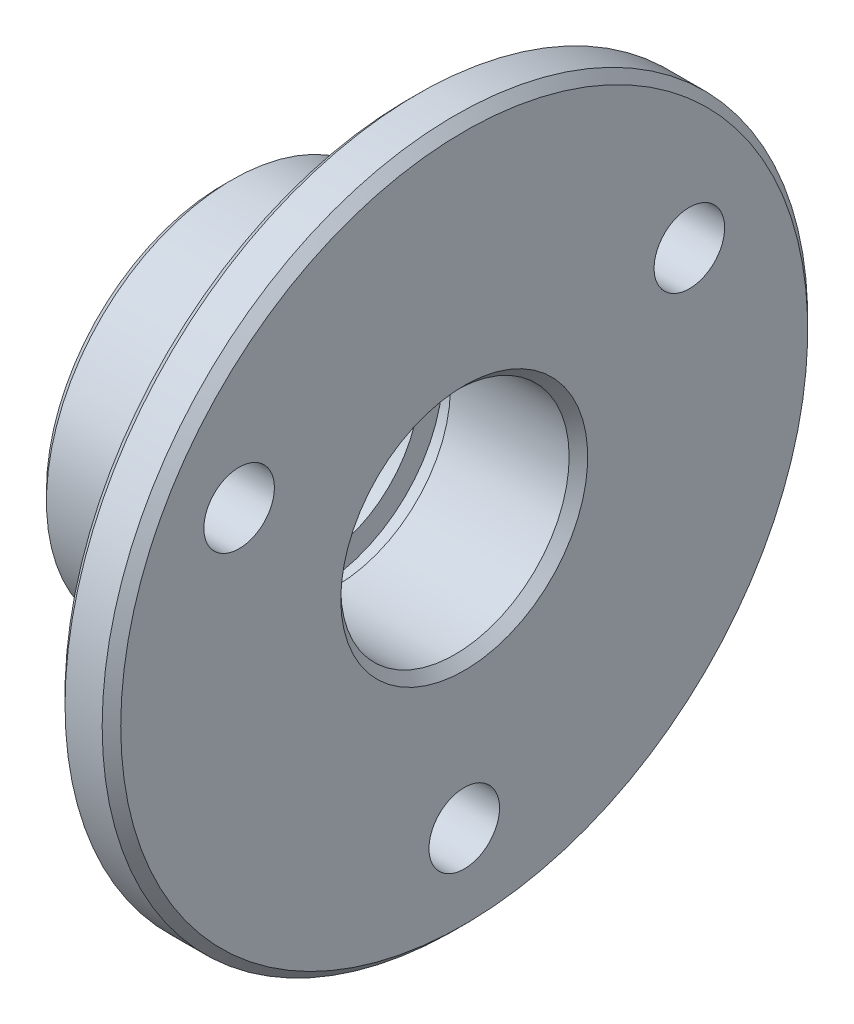
ISO-10303-21;
HEADER;
FILE_DESCRIPTION(('STEP AP214'),'2;1');
FILE_NAME('part.step','',(''),(''),'','','');
FILE_SCHEMA(('AUTOMOTIVE_DESIGN { 1 0 10303 214 1 1 1 1 }'));
ENDSEC;
DATA;
#1=APPLICATION_CONTEXT('core data for automotive mechanical design processes');
#2=APPLICATION_PROTOCOL_DEFINITION('international standard','automotive_design',2000,#1);
#3=PRODUCT_CONTEXT('',#1,'mechanical');
#4=PRODUCT('Part','Part','',(#3));
#5=PRODUCT_RELATED_PRODUCT_CATEGORY('part','',(#4));
#6=PRODUCT_DEFINITION_FORMATION('','',#4);
#7=PRODUCT_DEFINITION_CONTEXT('part definition',#1,'design');
#8=PRODUCT_DEFINITION('design','',#6,#7);
#9=PRODUCT_DEFINITION_SHAPE('','',#8);
#10=(LENGTH_UNIT() NAMED_UNIT(*) SI_UNIT(.MILLI.,.METRE.));
#11=(NAMED_UNIT(*) PLANE_ANGLE_UNIT() SI_UNIT($,.RADIAN.));
#12=(NAMED_UNIT(*) SI_UNIT($,.STERADIAN.) SOLID_ANGLE_UNIT());
#13=UNCERTAINTY_MEASURE_WITH_UNIT(LENGTH_MEASURE(1.E-05),#10,'distance_accuracy_value','');
#14=(GEOMETRIC_REPRESENTATION_CONTEXT(3) GLOBAL_UNCERTAINTY_ASSIGNED_CONTEXT((#13)) GLOBAL_UNIT_ASSIGNED_CONTEXT((#10,
#11,#12)) REPRESENTATION_CONTEXT('',''));
#15=CARTESIAN_POINT('',(0.,0.,0.));
#16=DIRECTION('',(0.,0.,1.));
#17=DIRECTION('',(1.,0.,0.));
#18=AXIS2_PLACEMENT_3D('',#15,#16,#17);
#19=CARTESIAN_POINT('',(44.2842712474619,0.,0.));
#20=DIRECTION('',(-1.,0.,0.));
#21=DIRECTION('',(0.,0.,1.));
#22=AXIS2_PLACEMENT_3D('',#19,#20,#21);
#23=CYLINDRICAL_SURFACE('',#22,10.);
#24=CARTESIAN_POINT('',(0.5,0.,0.));
#25=DIRECTION('',(1.,0.,0.));
#26=DIRECTION('',(0.,0.,-1.));
#27=AXIS2_PLACEMENT_3D('',#24,#25,#26);
#28=CIRCLE('',#27,10.);
#29=CARTESIAN_POINT('',(0.5,0.,-10.));
#30=VERTEX_POINT('',#29);
#31=EDGE_CURVE('E67',#30,#30,#28,.T.);
#32=ORIENTED_EDGE('',*,*,#31,.T.);
#33=EDGE_LOOP('',(#32));
#34=FACE_BOUND('',#33,.T.);
#35=CARTESIAN_POINT('',(6.9465,9.92156741649221,1.25));
#36=CARTESIAN_POINT('',(6.87658185810409,9.92156842085664,1.24999702741697));
#37=CARTESIAN_POINT('',(6.80662001754759,9.92231447559472,1.24411394951064));
#38=CARTESIAN_POINT('',(6.6686433872977,9.92521695489985,1.22073820686067));
#39=CARTESIAN_POINT('',(6.60063070975148,9.92737485321481,1.20323341054565));
#40=CARTESIAN_POINT('',(6.46857005894199,9.93285286887714,1.15713834641298));
#41=CARTESIAN_POINT('',(6.40451942894067,9.93617219726825,1.12855560239912));
#42=CARTESIAN_POINT('',(6.28213577408846,9.94359811759954,1.06113209921476));
#43=CARTESIAN_POINT('',(6.22380177412847,9.94770457492142,1.02229309368739));
#44=CARTESIAN_POINT('',(6.11416887643894,9.9562677962195,0.935226725132208));
#45=CARTESIAN_POINT('',(6.06290659884056,9.96072620851022,0.886953407512147));
#46=CARTESIAN_POINT('',(5.96918861553046,9.96947616437916,0.782487630335613));
#47=CARTESIAN_POINT('',(5.92673334795266,9.97376769964692,0.726294777029015));
#48=CARTESIAN_POINT('',(5.85170321024682,9.98171722306411,0.607354915337984));
#49=CARTESIAN_POINT('',(5.81916147745017,9.98537306923403,0.544586847780555));
#50=CARTESIAN_POINT('',(5.76509440002952,9.99162118477263,0.414423359027957));
#51=CARTESIAN_POINT('',(5.74356864653674,9.99421349361484,0.347028109680451));
#52=CARTESIAN_POINT('',(5.71225396583279,9.99803084353114,0.209897843875555));
#53=CARTESIAN_POINT('',(5.70240416073806,9.9992629741797,0.140176929831687));
#54=CARTESIAN_POINT('',(5.69453230748173,10.0002453486461,6.16003432718786E-05));
#55=CARTESIAN_POINT('',(5.69650979402373,9.99999565076039,-0.0703327884973868));
#56=CARTESIAN_POINT('',(5.71218760137872,9.99804823885005,-0.209382634487275));
#57=CARTESIAN_POINT('',(5.72582244924069,9.99635861227864,-0.278045602882228));
#58=CARTESIAN_POINT('',(5.76432558831497,9.99173027971167,-0.412101081952689));
#59=CARTESIAN_POINT('',(5.78919409308342,9.98879154997023,-0.477493530428104));
#60=CARTESIAN_POINT('',(5.8495282463919,9.98198128903956,-0.60335440771932));
#61=CARTESIAN_POINT('',(5.88502222886509,9.97810726921619,-0.66380911392026));
#62=CARTESIAN_POINT('',(5.96557918110802,9.96985984532641,-0.777928726153239));
#63=CARTESIAN_POINT('',(6.01064258973429,9.96548641836132,-0.831593320608679));
#64=CARTESIAN_POINT('',(6.10942590929919,9.95669433761757,-0.930994015386473));
#65=CARTESIAN_POINT('',(6.16320287977334,9.95227557902364,-0.976673419997998));
#66=CARTESIAN_POINT('',(6.27769077839123,9.9439203597029,-1.05836642531255));
#67=CARTESIAN_POINT('',(6.33840172826903,9.9399839004879,-1.09437999571755));
#68=CARTESIAN_POINT('',(6.46508474778117,9.93303901306359,-1.15572228679137));
#69=CARTESIAN_POINT('',(6.5310590399766,9.93003097954065,-1.18104646493116));
#70=CARTESIAN_POINT('',(6.66636972676342,9.92529121247978,-1.22024082723404));
#71=CARTESIAN_POINT('',(6.73570595915436,9.92355941743351,-1.23411156339981));
#72=CARTESIAN_POINT('',(6.87527159099989,9.92157944392025,-1.2499302159543));
#73=CARTESIAN_POINT('',(6.9454918115444,9.92132133721188,-1.25195792099914));
#74=CARTESIAN_POINT('',(7.08527096483271,9.92229170559824,-1.24424347661528));
#75=CARTESIAN_POINT('',(7.15482991163966,9.92352014900725,-1.2345015780549));
#76=CARTESIAN_POINT('',(7.29107288178893,9.92731614241993,-1.20359164289886));
#77=CARTESIAN_POINT('',(7.3577658075952,9.92987916347331,-1.18246224187303));
#78=CARTESIAN_POINT('',(7.48666207742658,9.93605184985404,-1.12941685955806));
#79=CARTESIAN_POINT('',(7.54886526362044,9.93966155195382,-1.09750049929061));
#80=CARTESIAN_POINT('',(7.6673773219065,9.94754465676617,-1.02359101107746));
#81=CARTESIAN_POINT('',(7.72365333265721,9.95182146368541,-0.981545559788551));
#82=CARTESIAN_POINT('',(7.82837827696752,9.96054619775512,-0.888645371184476));
#83=CARTESIAN_POINT('',(7.87682690593399,9.96499413155644,-0.83779029121274));
#84=CARTESIAN_POINT('',(7.9648020936672,9.97359044343479,-0.72836588777926));
#85=CARTESIAN_POINT('',(8.0042762233975,9.97773696956261,-0.669754246058515));
#86=CARTESIAN_POINT('',(8.0728191088169,9.98523556515805,-0.546686290840893));
#87=CARTESIAN_POINT('',(8.10188807424049,9.98858765063858,-0.48223009518416));
#88=CARTESIAN_POINT('',(8.14870889345402,9.99411145326594,-0.349476929569726));
#89=CARTESIAN_POINT('',(8.16649104801581,9.99628632843852,-0.281190783255888));
#90=CARTESIAN_POINT('',(8.19033204461338,9.99922377338782,-0.142573028638979));
#91=CARTESIAN_POINT('',(8.19639141529962,9.99998640685089,-0.0722415127190522));
#92=CARTESIAN_POINT('',(8.19660496114608,10.0000131400683,0.0679585916718929));
#93=CARTESIAN_POINT('',(8.19083998028399,9.9992874158392,0.137827068857368));
#94=CARTESIAN_POINT('',(8.16773969328458,9.99643920578969,0.275593870726307));
#95=CARTESIAN_POINT('',(8.15040439519412,9.99431672094073,0.343492196779925));
#96=CARTESIAN_POINT('',(8.10468094282515,9.98891242606016,0.475380721493659));
#97=CARTESIAN_POINT('',(8.07629666031339,9.98563102217235,0.539372280079787));
#98=CARTESIAN_POINT('',(8.00928934269622,9.9782722380314,0.661696668572013));
#99=CARTESIAN_POINT('',(7.97066618586915,9.97419484831559,0.720029431194016));
#100=CARTESIAN_POINT('',(7.88397839233181,9.96566596962789,0.829793383981279));
#101=CARTESIAN_POINT('',(7.83585360323817,9.9612122063946,0.88117689391715));
#102=CARTESIAN_POINT('',(7.73165352798557,9.95245079506771,0.975170559409672));
#103=CARTESIAN_POINT('',(7.67557636125455,9.94814318183499,1.01777863389674));
#104=CARTESIAN_POINT('',(7.55681503865132,9.94014405697344,1.09315262125802));
#105=CARTESIAN_POINT('',(7.49410620503245,9.93645498876141,1.12587989158337));
#106=CARTESIAN_POINT('',(7.36407162970262,9.93013929059811,1.18029264417168));
#107=CARTESIAN_POINT('',(7.2967510003483,9.92751150576939,1.20199013561416));
#108=CARTESIAN_POINT('',(7.18198500647823,9.92425393409921,1.22853294811899));
#109=CARTESIAN_POINT('',(7.13526352423121,9.92325150760955,1.23657151550529));
#110=CARTESIAN_POINT('',(7.04120137501654,9.92190791114956,1.24730602795275));
#111=CARTESIAN_POINT('',(6.99386071274952,9.92156673616213,1.25000201354966));
#112=CARTESIAN_POINT('',(6.9465,9.92156741649221,1.25));
#113=B_SPLINE_CURVE_WITH_KNOTS('',3,(#35,#36,#37,#38,#39,#40,#41,#42,#43,#44,#45,#46,#47,#48,
#49,#50,#51,#52,#53,#54,#55,#56,#57,#58,#59,#60,#61,#62,#63,#64,#65,#66,#67,#68,#69,#70,#71,#72,
#73,#74,#75,#76,#77,#78,#79,#80,#81,#82,#83,#84,#85,#86,#87,#88,#89,#90,#91,#92,#93,#94,#95,#96,
#97,#98,#99,#100,#101,#102,#103,#104,#105,#106,#107,#108,#109,#110,#111,#112),.UNSPECIFIED.,.T.,
.F.,(4,2,2,2,2,2,2,2,2,2,2,2,2,2,2,2,2,2,2,2,2,2,2,2,2,2,2,2,2,2,2,2,2,2,2,2,2,2,4),(0.,
0.20958140873962,0.419381938076191,0.6290402262906,0.838662689753063,1.04933288774533,
1.26001356371289,1.4713909307287,1.68276045169915,1.89302298470729,2.10327724585054,
2.31235832466519,2.52144337835894,2.73109102206402,2.94074828234552,3.15183848688885,
3.36292935309712,3.57410983369504,3.78528013578094,3.99502608902941,4.20476757163557,
4.41380188146366,4.62284353605926,4.83298909772055,5.04314283497405,5.25449442946171,
5.46584176354439,5.6766192839247,5.88738729886405,6.09671908144127,6.30605071843394,
6.51530906772045,6.72456990482124,6.93520064445417,7.14588127719914,7.35737548852417,
7.56863892991008,7.71060494816474,7.85256988927736),.UNSPECIFIED.);
#114=CARTESIAN_POINT('',(6.9465,9.92156741649221,1.25));
#115=VERTEX_POINT('',#114);
#116=EDGE_CURVE('E137',#115,#115,#113,.T.);
#117=ORIENTED_EDGE('',*,*,#116,.T.);
#118=EDGE_LOOP('',(#117));
#119=FACE_BOUND('',#118,.T.);
#120=CARTESIAN_POINT('',(9.99999999999999,0.,0.));
#121=DIRECTION('',(1.,0.,0.));
#122=DIRECTION('',(0.,0.,-1.));
#123=AXIS2_PLACEMENT_3D('',#120,#121,#122);
#124=CIRCLE('',#123,10.);
#125=CARTESIAN_POINT('',(9.99999999999999,0.,-10.));
#126=VERTEX_POINT('',#125);
#127=EDGE_CURVE('E90',#126,#126,#124,.T.);
#128=ORIENTED_EDGE('',*,*,#127,.F.);
#129=EDGE_LOOP('',(#128));
#130=FACE_BOUND('',#129,.T.);
#131=ADVANCED_FACE('F35',(#34,#119,#130),#23,.T.);
#132=CARTESIAN_POINT('',(0.,0.,0.));
#133=DIRECTION('',(1.,0.,0.));
#134=DIRECTION('',(0.,0.,-1.));
#135=AXIS2_PLACEMENT_3D('',#132,#133,#134);
#136=PLANE('',#135);
#137=CARTESIAN_POINT('',(0.,0.,0.));
#138=DIRECTION('',(1.,0.,0.));
#139=DIRECTION('',(0.,0.,-1.));
#140=AXIS2_PLACEMENT_3D('',#137,#138,#139);
#141=CIRCLE('',#140,9.50000000000001);
#142=CARTESIAN_POINT('',(0.,0.,-9.50000000000001));
#143=VERTEX_POINT('',#142);
#144=EDGE_CURVE('E182',#143,#143,#141,.F.);
#145=ORIENTED_EDGE('',*,*,#144,.T.);
#146=EDGE_LOOP('',(#145));
#147=FACE_BOUND('',#146,.T.);
#148=CARTESIAN_POINT('',(0.,0.,0.));
#149=DIRECTION('',(1.,0.,0.));
#150=DIRECTION('',(0.,0.,-1.));
#151=AXIS2_PLACEMENT_3D('',#148,#149,#150);
#152=CIRCLE('',#151,5.99999999999999);
#153=CARTESIAN_POINT('',(0.,0.,-5.99999999999999));
#154=VERTEX_POINT('',#153);
#155=EDGE_CURVE('E202',#154,#154,#152,.T.);
#156=ORIENTED_EDGE('',*,*,#155,.T.);
#157=EDGE_LOOP('',(#156));
#158=FACE_BOUND('',#157,.T.);
#159=ADVANCED_FACE('F122',(#147,#158),#136,.F.);
#160=CARTESIAN_POINT('',(13.,20.2,30.));
#161=DIRECTION('',(-1.,0.,0.));
#162=DIRECTION('',(0.,0.,1.));
#163=AXIS2_PLACEMENT_3D('',#160,#161,#162);
#164=PLANE('',#163);
#165=CARTESIAN_POINT('',(13.,0.,0.));
#166=DIRECTION('',(-1.,0.,0.));
#167=DIRECTION('',(0.,0.,1.));
#168=AXIS2_PLACEMENT_3D('',#165,#166,#167);
#169=CIRCLE('',#168,18.5);
#170=CARTESIAN_POINT('',(13.,0.,18.5));
#171=VERTEX_POINT('',#170);
#172=EDGE_CURVE('E11',#171,#171,#169,.F.);
#173=ORIENTED_EDGE('',*,*,#172,.T.);
#174=EDGE_LOOP('',(#173));
#175=FACE_BOUND('',#174,.T.);
#176=CARTESIAN_POINT('',(13.,6.99999999999989,-12.1243556529822));
#177=DIRECTION('',(1.,0.,0.));
#178=DIRECTION('',(0.,0.,-1.));
#179=AXIS2_PLACEMENT_3D('',#176,#177,#178);
#180=CIRCLE('',#179,1.89999999999999);
#181=CARTESIAN_POINT('',(13.,6.99999999999989,-14.0243556529822));
#182=VERTEX_POINT('',#181);
#183=EDGE_CURVE('E236',#182,#182,#180,.T.);
#184=ORIENTED_EDGE('',*,*,#183,.F.);
#185=EDGE_LOOP('',(#184));
#186=FACE_BOUND('',#185,.T.);
#187=CARTESIAN_POINT('',(13.,7.00000000000006,12.1243556529821));
#188=DIRECTION('',(1.,0.,0.));
#189=DIRECTION('',(0.,0.,-1.));
#190=AXIS2_PLACEMENT_3D('',#187,#188,#189);
#191=CIRCLE('',#190,1.89999999999999);
#192=CARTESIAN_POINT('',(13.,7.00000000000006,10.2243556529821));
#193=VERTEX_POINT('',#192);
#194=EDGE_CURVE('E240',#193,#193,#191,.T.);
#195=ORIENTED_EDGE('',*,*,#194,.F.);
#196=EDGE_LOOP('',(#195));
#197=FACE_BOUND('',#196,.T.);
#198=CARTESIAN_POINT('',(13.,-14.,0.));
#199=DIRECTION('',(1.,0.,0.));
#200=DIRECTION('',(0.,0.,-1.));
#201=AXIS2_PLACEMENT_3D('',#198,#199,#200);
#202=CIRCLE('',#201,1.89999999999999);
#203=CARTESIAN_POINT('',(13.,-14.,-1.89999999999999));
#204=VERTEX_POINT('',#203);
#205=EDGE_CURVE('E244',#204,#204,#202,.T.);
#206=ORIENTED_EDGE('',*,*,#205,.F.);
#207=EDGE_LOOP('',(#206));
#208=FACE_BOUND('',#207,.T.);
#209=CARTESIAN_POINT('',(13.,0.,0.));
#210=DIRECTION('',(-1.,0.,0.));
#211=DIRECTION('',(0.,0.,1.));
#212=AXIS2_PLACEMENT_3D('',#209,#210,#211);
#213=CIRCLE('',#212,6.65000000000003);
#214=CARTESIAN_POINT('',(13.,0.,6.65000000000003));
#215=VERTEX_POINT('',#214);
#216=EDGE_CURVE('E68',#215,#215,#213,.T.);
#217=ORIENTED_EDGE('',*,*,#216,.T.);
#218=EDGE_LOOP('',(#217));
#219=FACE_BOUND('',#218,.T.);
#220=ADVANCED_FACE('F128',(#175,#186,#197,#208,#219),#164,.F.);
#221=CARTESIAN_POINT('',(0.,0.,0.));
#222=DIRECTION('',(-1.,0.,0.));
#223=DIRECTION('',(0.,0.,1.));
#224=AXIS2_PLACEMENT_3D('',#221,#222,#223);
#225=CYLINDRICAL_SURFACE('',#224,5.49999999999999);
#226=CARTESIAN_POINT('',(5.105,0.,0.));
#227=DIRECTION('',(-1.,0.,0.));
#228=DIRECTION('',(0.,0.,1.));
#229=AXIS2_PLACEMENT_3D('',#226,#227,#228);
#230=CIRCLE('',#229,5.49999999999999);
#231=CARTESIAN_POINT('',(5.105,0.,5.49999999999999));
#232=VERTEX_POINT('',#231);
#233=EDGE_CURVE('E78',#232,#232,#230,.F.);
#234=ORIENTED_EDGE('',*,*,#233,.T.);
#235=EDGE_LOOP('',(#234));
#236=FACE_BOUND('',#235,.T.);
#237=CARTESIAN_POINT('',(0.499999999999994,0.,0.));
#238=DIRECTION('',(1.,0.,0.));
#239=DIRECTION('',(0.,0.,-1.));
#240=AXIS2_PLACEMENT_3D('',#237,#238,#239);
#241=CIRCLE('',#240,5.49999999999999);
#242=CARTESIAN_POINT('',(0.499999999999994,0.,-5.49999999999999));
#243=VERTEX_POINT('',#242);
#244=EDGE_CURVE('E81',#243,#243,#241,.F.);
#245=ORIENTED_EDGE('',*,*,#244,.T.);
#246=EDGE_LOOP('',(#245));
#247=FACE_BOUND('',#246,.T.);
#248=ADVANCED_FACE('F221',(#236,#247),#225,.F.);
#249=CARTESIAN_POINT('',(0.499999999999994,0.,0.));
#250=DIRECTION('',(-1.,0.,0.));
#251=DIRECTION('',(0.,0.,1.));
#252=AXIS2_PLACEMENT_3D('',#249,#250,#251);
#253=CONICAL_SURFACE('',#252,5.49999999999999,0.78539816339745);
#254=ORIENTED_EDGE('',*,*,#155,.F.);
#255=EDGE_LOOP('',(#254));
#256=FACE_BOUND('',#255,.T.);
#257=ORIENTED_EDGE('',*,*,#244,.F.);
#258=EDGE_LOOP('',(#257));
#259=FACE_BOUND('',#258,.T.);
#260=ADVANCED_FACE('F135',(#256,#259),#253,.F.);
#261=CARTESIAN_POINT('',(5.105,0.,0.));
#262=DIRECTION('',(-1.,0.,0.));
#263=DIRECTION('',(0.,0.,1.));
#264=AXIS2_PLACEMENT_3D('',#261,#262,#263);
#265=PLANE('',#264);
#266=ORIENTED_EDGE('',*,*,#233,.F.);
#267=EDGE_LOOP('',(#266));
#268=FACE_BOUND('',#267,.T.);
#269=CARTESIAN_POINT('',(5.105,0.,0.));
#270=DIRECTION('',(1.,0.,0.));
#271=DIRECTION('',(0.,0.,-1.));
#272=AXIS2_PLACEMENT_3D('',#269,#270,#271);
#273=CIRCLE('',#272,6.75);
#274=CARTESIAN_POINT('',(5.105,0.,-6.75));
#275=VERTEX_POINT('',#274);
#276=EDGE_CURVE('E83',#275,#275,#273,.T.);
#277=ORIENTED_EDGE('',*,*,#276,.T.);
#278=EDGE_LOOP('',(#277));
#279=FACE_BOUND('',#278,.T.);
#280=ADVANCED_FACE('F212',(#268,#279),#265,.F.);
#281=CARTESIAN_POINT('',(-12.2898268171891,0.,0.));
#282=DIRECTION('',(1.,0.,0.));
#283=DIRECTION('',(0.,0.,-1.));
#284=AXIS2_PLACEMENT_3D('',#281,#282,#283);
#285=CYLINDRICAL_SURFACE('',#284,6.15);
#286=CARTESIAN_POINT('',(12.5,0.,0.));
#287=DIRECTION('',(-1.,0.,0.));
#288=DIRECTION('',(0.,0.,1.));
#289=AXIS2_PLACEMENT_3D('',#286,#287,#288);
#290=CIRCLE('',#289,6.15);
#291=CARTESIAN_POINT('',(12.5,0.,6.15));
#292=VERTEX_POINT('',#291);
#293=EDGE_CURVE('E87',#292,#292,#290,.F.);
#294=ORIENTED_EDGE('',*,*,#293,.T.);
#295=EDGE_LOOP('',(#294));
#296=FACE_BOUND('',#295,.T.);
#297=CARTESIAN_POINT('',(6.105,0.,0.));
#298=DIRECTION('',(1.,0.,0.));
#299=DIRECTION('',(0.,0.,-1.));
#300=AXIS2_PLACEMENT_3D('',#297,#298,#299);
#301=CIRCLE('',#300,6.15);
#302=CARTESIAN_POINT('',(6.105,6.08014163075171,-0.924325564939107));
#303=VERTEX_POINT('',#302);
#304=CARTESIAN_POINT('',(6.105,6.08014163075171,0.9243255649391));
#305=VERTEX_POINT('',#304);
#306=EDGE_CURVE('E73',#303,#305,#301,.F.);
#307=ORIENTED_EDGE('',*,*,#306,.T.);
#308=CARTESIAN_POINT('',(6.105,6.08014163075171,0.9243255649391));
#309=CARTESIAN_POINT('',(6.13085305480951,6.07656355550232,0.947861027726717));
#310=CARTESIAN_POINT('',(6.15768303106448,6.07301218907702,0.970303071590083));
#311=CARTESIAN_POINT('',(6.21314075885379,6.0660578089029,1.01287104723516));
#312=CARTESIAN_POINT('',(6.24176857421632,6.06265480042847,1.03299689671373));
#313=CARTESIAN_POINT('',(6.3300643684973,6.05281639245906,1.08967338820507));
#314=CARTESIAN_POINT('',(6.39218684059717,6.0467455419307,1.12256129360557));
#315=CARTESIAN_POINT('',(6.52121509642845,6.03628439109708,1.17752297657691));
#316=CARTESIAN_POINT('',(6.58812525715888,6.0318956525207,1.19958670991931));
#317=CARTESIAN_POINT('',(6.7247790085103,6.02532256113965,1.23217992049905));
#318=CARTESIAN_POINT('',(6.79452100186436,6.02313698314888,1.24271580869433));
#319=CARTESIAN_POINT('',(6.93385224871264,6.02124349376346,1.25185808692812));
#320=CARTESIAN_POINT('',(7.00343051776315,6.02150206628539,1.25062584820888));
#321=CARTESIAN_POINT('',(7.14138596585417,6.02438567789627,1.23665951109884));
#322=CARTESIAN_POINT('',(7.20976290398018,6.02701118624986,1.22392313191586));
#323=CARTESIAN_POINT('',(7.34296395957565,6.03430049361819,1.1874583433613));
#324=CARTESIAN_POINT('',(7.40780661460263,6.03895220837911,1.16379505233088));
#325=CARTESIAN_POINT('',(7.53261872530814,6.04976566608569,1.10620498233078));
#326=CARTESIAN_POINT('',(7.59258808005402,6.05592744029613,1.07227799085464));
#327=CARTESIAN_POINT('',(7.70701091367883,6.06919192979061,0.994478042646225));
#328=CARTESIAN_POINT('',(7.7613593742708,6.07630826354429,0.950452956722653));
#329=CARTESIAN_POINT('',(7.86197088601764,6.09061586747225,0.853974151950582));
#330=CARTESIAN_POINT('',(7.90823301351852,6.09780714610775,0.801519471551101));
#331=CARTESIAN_POINT('',(7.99196129161907,6.11156747200375,0.68884015944968));
#332=CARTESIAN_POINT('',(8.0293043813276,6.11812714247888,0.628522810530262));
#333=CARTESIAN_POINT('',(8.09330696289819,6.12977744354486,0.502332287995732));
#334=CARTESIAN_POINT('',(8.11996728726488,6.13486818859997,0.436459547795028));
#335=CARTESIAN_POINT('',(8.16157322884085,6.14296247523578,0.301696730418933));
#336=CARTESIAN_POINT('',(8.1766310322728,6.14598597229383,0.232842527450426));
#337=CARTESIAN_POINT('',(8.19497436210911,6.14968337515192,0.0935242895227528));
#338=CARTESIAN_POINT('',(8.19826123805074,6.15035755030157,0.0230604400419149));
#339=CARTESIAN_POINT('',(8.19300342956708,6.14928985512759,-0.116200368816541));
#340=CARTESIAN_POINT('',(8.18465888863978,6.14758885393528,-0.185005303954254));
#341=CARTESIAN_POINT('',(8.15676040682269,6.1420310363133,-0.320210445621568));
#342=CARTESIAN_POINT('',(8.13720634759646,6.13817419712493,-0.386610626756839));
#343=CARTESIAN_POINT('',(8.08744190663687,6.12871553057989,-0.515285395868851));
#344=CARTESIAN_POINT('',(8.05721283264521,6.12311064436691,-0.577552518066885));
#345=CARTESIAN_POINT('',(7.9869748262696,6.11076071125141,-0.696178872936404));
#346=CARTESIAN_POINT('',(7.946964732511,6.10401552898225,-0.752537402899616));
#347=CARTESIAN_POINT('',(7.85745657780104,6.08998016507384,-0.858819190916257));
#348=CARTESIAN_POINT('',(7.80780186329061,6.08268240279794,-0.908609578812748));
#349=CARTESIAN_POINT('',(7.70082664276205,6.06845974400481,-0.999201871633616));
#350=CARTESIAN_POINT('',(7.64350582847693,6.06153486249747,-1.04000341492642));
#351=CARTESIAN_POINT('',(7.52230702543422,6.04879347604398,-1.11172790540531));
#352=CARTESIAN_POINT('',(7.45838528234785,6.04298520813462,-1.14257849760103));
#353=CARTESIAN_POINT('',(7.3261200006441,6.03322204746846,-1.19306238460017));
#354=CARTESIAN_POINT('',(7.25777679047286,6.02926701722447,-1.21269651154956));
#355=CARTESIAN_POINT('',(7.11971742239783,6.02372984947255,-1.23990751508486));
#356=CARTESIAN_POINT('',(7.05003788941703,6.0221125798996,-1.24766301299934));
#357=CARTESIAN_POINT('',(6.91035689421529,6.02133136534757,-1.25142841062552));
#358=CARTESIAN_POINT('',(6.84035549019239,6.02216699302366,-1.24744035630364));
#359=CARTESIAN_POINT('',(6.70303917883977,6.02616165026879,-1.22799435323089));
#360=CARTESIAN_POINT('',(6.63570043748203,6.02928817007623,-1.21269686821923));
#361=CARTESIAN_POINT('',(6.50454788576474,6.03746926871258,-1.17128402789271));
#362=CARTESIAN_POINT('',(6.44073425300042,6.04252394458091,-1.14516812810761));
#363=CARTESIAN_POINT('',(6.32975154944882,6.05292612231923,-1.08869033319848));
#364=CARTESIAN_POINT('',(6.28169164838773,6.0580450971698,-1.06001649311512));
#365=CARTESIAN_POINT('',(6.18991608942425,6.06879934022507,-0.996593342670475));
#366=CARTESIAN_POINT('',(6.1461950822075,6.07443395580316,-0.961851662869893));
#367=CARTESIAN_POINT('',(6.105,6.08014163075171,-0.924325564939101));
#368=B_SPLINE_CURVE_WITH_KNOTS('',3,(#308,#309,#310,#311,#312,#313,#314,#315,#316,#317,#318,
#319,#320,#321,#322,#323,#324,#325,#326,#327,#328,#329,#330,#331,#332,#333,#334,#335,#336,#337,
#338,#339,#340,#341,#342,#343,#344,#345,#346,#347,#348,#349,#350,#351,#352,#353,#354,#355,#356,
#357,#358,#359,#360,#361,#362,#363,#364,#365,#366,#367),.UNSPECIFIED.,.F.,.F.,(4,2,2,2,2,2,2,2,
2,2,2,2,2,2,2,2,2,2,2,2,2,2,2,2,2,2,2,2,2,4),(0.,0.10536864220033,0.210741027391577,
0.421316098652121,0.632086203971878,0.842739034454667,1.05050746658237,1.25831709958493,
1.4649039754186,1.67149512885662,1.88143091891909,2.09139067305696,2.30409868762113,
2.51679012268974,2.72739827343664,2.93798227717806,3.14498712766426,3.35199416349564,
3.55936548676658,3.76676144477715,3.97786048756595,4.18896802156214,4.40157765173184,
4.61417150641187,4.82353602338758,5.03286406695074,5.23927772084521,5.44570176440861,
5.61380796018076,5.7817042578475),.UNSPECIFIED.);
#369=EDGE_CURVE('E59',#305,#303,#368,.T.);
#370=ORIENTED_EDGE('',*,*,#369,.T.);
#371=EDGE_LOOP('',(#307,#370));
#372=FACE_BOUND('',#371,.T.);
#373=ADVANCED_FACE('F77',(#296,#372),#285,.F.);
#374=CARTESIAN_POINT('',(6.105,0.,0.));
#375=DIRECTION('',(1.,0.,0.));
#376=DIRECTION('',(0.,0.,-1.));
#377=AXIS2_PLACEMENT_3D('',#374,#375,#376);
#378=PLANE('',#377);
#379=ORIENTED_EDGE('',*,*,#306,.F.);
#380=DIRECTION('',(0.,1.,0.));
#381=VECTOR('',#380,1.);
#382=CARTESIAN_POINT('',(6.105,10.,-0.924325564939105));
#383=LINE('',#382,#381);
#384=CARTESIAN_POINT('',(6.105,6.68641325749464,-0.924325564939106));
#385=VERTEX_POINT('',#384);
#386=EDGE_CURVE('E50',#303,#385,#383,.T.);
#387=ORIENTED_EDGE('',*,*,#386,.T.);
#388=CARTESIAN_POINT('',(6.105,0.,0.));
#389=DIRECTION('',(1.,0.,0.));
#390=DIRECTION('',(0.,0.,-1.));
#391=AXIS2_PLACEMENT_3D('',#388,#389,#390);
#392=CIRCLE('',#391,6.75);
#393=CARTESIAN_POINT('',(6.105,6.68641325749464,0.924325564939105));
#394=VERTEX_POINT('',#393);
#395=EDGE_CURVE('E75',#394,#385,#392,.T.);
#396=ORIENTED_EDGE('',*,*,#395,.F.);
#397=DIRECTION('',(0.,1.,0.));
#398=VECTOR('',#397,1.);
#399=CARTESIAN_POINT('',(6.105,10.,0.924325564939105));
#400=LINE('',#399,#398);
#401=EDGE_CURVE('E63',#394,#305,#400,.F.);
#402=ORIENTED_EDGE('',*,*,#401,.T.);
#403=EDGE_LOOP('',(#379,#387,#396,#402));
#404=FACE_BOUND('',#403,.T.);
#405=ADVANCED_FACE('F72',(#404),#378,.F.);
#406=CARTESIAN_POINT('',(6.105,0.,0.));
#407=DIRECTION('',(-1.,0.,0.));
#408=DIRECTION('',(0.,0.,1.));
#409=AXIS2_PLACEMENT_3D('',#406,#407,#408);
#410=CYLINDRICAL_SURFACE('',#409,6.75);
#411=CARTESIAN_POINT('',(6.105,6.68641325749464,0.924325564939105));
#412=CARTESIAN_POINT('',(6.07903251166029,6.68968132411506,0.900684045900174));
#413=CARTESIAN_POINT('',(6.05407498419657,6.69297115242522,0.875961251191395));
#414=CARTESIAN_POINT('',(6.00632420630091,6.69950530743562,0.824501707244092));
#415=CARTESIAN_POINT('',(5.98353095559999,6.70274963414152,0.797764958255865));
#416=CARTESIAN_POINT('',(5.91865946597108,6.71227417113218,0.714814620739696));
#417=CARTESIAN_POINT('',(5.88003449972961,6.71835315604907,0.655810796802703));
#418=CARTESIAN_POINT('',(5.81319404878309,6.72928583479496,0.532046759159625));
#419=CARTESIAN_POINT('',(5.78498645263544,6.7341385991935,0.467282229016519));
#420=CARTESIAN_POINT('',(5.73985050100824,6.74206992646761,0.333844346228971));
#421=CARTESIAN_POINT('',(5.72291784333782,6.74514916600842,0.265172495374614));
#422=CARTESIAN_POINT('',(5.70097284717842,6.749164480921,0.126617911982497));
#423=CARTESIAN_POINT('',(5.69583930620889,6.75012234367176,0.0567549867702348));
#424=CARTESIAN_POINT('',(5.6972968334767,6.74985244593826,-0.0828448300214524));
#425=CARTESIAN_POINT('',(5.70388767370968,6.74862472795705,-0.15258172402541));
#426=CARTESIAN_POINT('',(5.72846771152331,6.74414266292734,-0.289264965356092));
#427=CARTESIAN_POINT('',(5.74634926125229,6.74090746060666,-0.356231371712963));
#428=CARTESIAN_POINT('',(5.7928734212888,6.7327805152877,-0.486224764300174));
#429=CARTESIAN_POINT('',(5.82151861898376,6.72788837401901,-0.549250799083815));
#430=CARTESIAN_POINT('',(5.88797104002973,6.71710016359761,-0.668240654729331));
#431=CARTESIAN_POINT('',(5.92555084696168,6.7112299529512,-0.724334174516328));
#432=CARTESIAN_POINT('',(6.00917869615048,6.69902072267409,-0.829749741790779));
#433=CARTESIAN_POINT('',(6.0552269182019,6.69268169309152,-0.879071645469887));
#434=CARTESIAN_POINT('',(6.105,6.68641325749464,-0.924325564939106));
#435=B_SPLINE_CURVE_WITH_KNOTS('',3,(#411,#412,#413,#414,#415,#416,#417,#418,#419,#420,#421,
#422,#423,#424,#425,#426,#427,#428,#429,#430,#431,#432,#433,#434),.UNSPECIFIED.,.F.,.F.,(4,2,2,
2,2,2,2,2,2,2,2,4),(0.,0.105742917663906,0.211485822185942,0.422750147630842,0.63417412661966,
0.845517386024564,1.05467979933775,1.26383814510839,1.47103183782876,1.67827536808211,
1.88072192355592,2.08317277770851),.UNSPECIFIED.);
#436=EDGE_CURVE('E55',#394,#385,#435,.T.);
#437=ORIENTED_EDGE('',*,*,#436,.F.);
#438=ORIENTED_EDGE('',*,*,#395,.T.);
#439=EDGE_LOOP('',(#437,#438));
#440=FACE_BOUND('',#439,.T.);
#441=ORIENTED_EDGE('',*,*,#276,.F.);
#442=EDGE_LOOP('',(#441));
#443=FACE_BOUND('',#442,.T.);
#444=ADVANCED_FACE('F160',(#440,#443),#410,.F.);
#445=CARTESIAN_POINT('',(10.,0.,0.));
#446=DIRECTION('',(1.,0.,0.));
#447=DIRECTION('',(0.,0.,-1.));
#448=AXIS2_PLACEMENT_3D('',#445,#446,#447);
#449=PLANE('',#448);
#450=CARTESIAN_POINT('',(10.,0.,0.));
#451=DIRECTION('',(1.,0.,0.));
#452=DIRECTION('',(0.,0.,-1.));
#453=AXIS2_PLACEMENT_3D('',#450,#451,#452);
#454=CIRCLE('',#453,18.5);
#455=CARTESIAN_POINT('',(10.,0.,-18.5));
#456=VERTEX_POINT('',#455);
#457=EDGE_CURVE('E43',#456,#456,#454,.F.);
#458=ORIENTED_EDGE('',*,*,#457,.T.);
#459=EDGE_LOOP('',(#458));
#460=FACE_BOUND('',#459,.T.);
#461=CARTESIAN_POINT('',(10.,6.99999999999989,-12.1243556529822));
#462=DIRECTION('',(1.,0.,0.));
#463=DIRECTION('',(0.,0.,-1.));
#464=AXIS2_PLACEMENT_3D('',#461,#462,#463);
#465=CIRCLE('',#464,1.89999999999999);
#466=CARTESIAN_POINT('',(10.,6.99999999999989,-14.0243556529822));
#467=VERTEX_POINT('',#466);
#468=EDGE_CURVE('E192',#467,#467,#465,.T.);
#469=ORIENTED_EDGE('',*,*,#468,.T.);
#470=EDGE_LOOP('',(#469));
#471=FACE_BOUND('',#470,.T.);
#472=CARTESIAN_POINT('',(10.,7.00000000000006,12.1243556529821));
#473=DIRECTION('',(1.,0.,0.));
#474=DIRECTION('',(0.,0.,-1.));
#475=AXIS2_PLACEMENT_3D('',#472,#473,#474);
#476=CIRCLE('',#475,1.89999999999999);
#477=CARTESIAN_POINT('',(10.,7.00000000000006,10.2243556529821));
#478=VERTEX_POINT('',#477);
#479=EDGE_CURVE('E98',#478,#478,#476,.T.);
#480=ORIENTED_EDGE('',*,*,#479,.T.);
#481=EDGE_LOOP('',(#480));
#482=FACE_BOUND('',#481,.T.);
#483=CARTESIAN_POINT('',(10.,-14.,0.));
#484=DIRECTION('',(1.,0.,0.));
#485=DIRECTION('',(0.,0.,-1.));
#486=AXIS2_PLACEMENT_3D('',#483,#484,#485);
#487=CIRCLE('',#486,1.89999999999999);
#488=CARTESIAN_POINT('',(10.,-14.,-1.89999999999999));
#489=VERTEX_POINT('',#488);
#490=EDGE_CURVE('E158',#489,#489,#487,.T.);
#491=ORIENTED_EDGE('',*,*,#490,.T.);
#492=EDGE_LOOP('',(#491));
#493=FACE_BOUND('',#492,.T.);
#494=ORIENTED_EDGE('',*,*,#127,.T.);
#495=EDGE_LOOP('',(#494));
#496=FACE_BOUND('',#495,.T.);
#497=ADVANCED_FACE('F150',(#460,#471,#482,#493,#496),#449,.F.);
#498=CARTESIAN_POINT('',(13.,0.,0.));
#499=DIRECTION('',(-1.,0.,0.));
#500=DIRECTION('',(0.,0.,1.));
#501=AXIS2_PLACEMENT_3D('',#498,#499,#500);
#502=CYLINDRICAL_SURFACE('',#501,19.);
#503=CARTESIAN_POINT('',(10.5,0.,0.));
#504=DIRECTION('',(1.,0.,0.));
#505=DIRECTION('',(0.,0.,-1.));
#506=AXIS2_PLACEMENT_3D('',#503,#504,#505);
#507=CIRCLE('',#506,19.);
#508=CARTESIAN_POINT('',(10.5,0.,-19.));
#509=VERTEX_POINT('',#508);
#510=EDGE_CURVE('E178',#509,#509,#507,.T.);
#511=ORIENTED_EDGE('',*,*,#510,.T.);
#512=EDGE_LOOP('',(#511));
#513=FACE_BOUND('',#512,.T.);
#514=CARTESIAN_POINT('',(12.5,0.,0.));
#515=DIRECTION('',(-1.,0.,0.));
#516=DIRECTION('',(0.,0.,1.));
#517=AXIS2_PLACEMENT_3D('',#514,#515,#516);
#518=CIRCLE('',#517,19.);
#519=CARTESIAN_POINT('',(12.5,0.,19.));
#520=VERTEX_POINT('',#519);
#521=EDGE_CURVE('E181',#520,#520,#518,.T.);
#522=ORIENTED_EDGE('',*,*,#521,.T.);
#523=EDGE_LOOP('',(#522));
#524=FACE_BOUND('',#523,.T.);
#525=ADVANCED_FACE('F166',(#513,#524),#502,.T.);
#526=CARTESIAN_POINT('',(12.5,0.,0.));
#527=DIRECTION('',(1.,0.,0.));
#528=DIRECTION('',(0.,0.,-1.));
#529=AXIS2_PLACEMENT_3D('',#526,#527,#528);
#530=CONICAL_SURFACE('',#529,6.15,0.78539816339745);
#531=ORIENTED_EDGE('',*,*,#216,.F.);
#532=EDGE_LOOP('',(#531));
#533=FACE_BOUND('',#532,.T.);
#534=ORIENTED_EDGE('',*,*,#293,.F.);
#535=EDGE_LOOP('',(#534));
#536=FACE_BOUND('',#535,.T.);
#537=ADVANCED_FACE('F106',(#533,#536),#530,.F.);
#538=CARTESIAN_POINT('',(6.9465,10.,0.));
#539=DIRECTION('',(0.,1.,0.));
#540=DIRECTION('',(0.,0.,1.));
#541=AXIS2_PLACEMENT_3D('',#538,#539,#540);
#542=CYLINDRICAL_SURFACE('',#541,1.25);
#543=ORIENTED_EDGE('',*,*,#369,.F.);
#544=ORIENTED_EDGE('',*,*,#401,.F.);
#545=ORIENTED_EDGE('',*,*,#436,.T.);
#546=ORIENTED_EDGE('',*,*,#386,.F.);
#547=EDGE_LOOP('',(#543,#544,#545,#546));
#548=FACE_BOUND('',#547,.T.);
#549=ORIENTED_EDGE('',*,*,#116,.F.);
#550=EDGE_LOOP('',(#549));
#551=FACE_BOUND('',#550,.T.);
#552=ADVANCED_FACE('F61',(#548,#551),#542,.F.);
#553=CARTESIAN_POINT('',(13.,-14.,0.));
#554=DIRECTION('',(1.,0.,0.));
#555=DIRECTION('',(0.,0.,-1.));
#556=AXIS2_PLACEMENT_3D('',#553,#554,#555);
#557=CYLINDRICAL_SURFACE('',#556,1.89999999999999);
#558=ORIENTED_EDGE('',*,*,#205,.T.);
#559=EDGE_LOOP('',(#558));
#560=FACE_BOUND('',#559,.T.);
#561=ORIENTED_EDGE('',*,*,#490,.F.);
#562=EDGE_LOOP('',(#561));
#563=FACE_BOUND('',#562,.T.);
#564=ADVANCED_FACE('F148',(#560,#563),#557,.F.);
#565=CARTESIAN_POINT('',(13.,7.00000000000006,12.1243556529821));
#566=DIRECTION('',(1.,0.,0.));
#567=DIRECTION('',(0.,0.,-1.));
#568=AXIS2_PLACEMENT_3D('',#565,#566,#567);
#569=CYLINDRICAL_SURFACE('',#568,1.89999999999999);
#570=ORIENTED_EDGE('',*,*,#194,.T.);
#571=EDGE_LOOP('',(#570));
#572=FACE_BOUND('',#571,.T.);
#573=ORIENTED_EDGE('',*,*,#479,.F.);
#574=EDGE_LOOP('',(#573));
#575=FACE_BOUND('',#574,.T.);
#576=ADVANCED_FACE('F255',(#572,#575),#569,.F.);
#577=CARTESIAN_POINT('',(13.,6.99999999999989,-12.1243556529822));
#578=DIRECTION('',(1.,0.,0.));
#579=DIRECTION('',(0.,0.,-1.));
#580=AXIS2_PLACEMENT_3D('',#577,#578,#579);
#581=CYLINDRICAL_SURFACE('',#580,1.89999999999999);
#582=ORIENTED_EDGE('',*,*,#183,.T.);
#583=EDGE_LOOP('',(#582));
#584=FACE_BOUND('',#583,.T.);
#585=ORIENTED_EDGE('',*,*,#468,.F.);
#586=EDGE_LOOP('',(#585));
#587=FACE_BOUND('',#586,.T.);
#588=ADVANCED_FACE('F111',(#584,#587),#581,.F.);
#589=CARTESIAN_POINT('',(0.5,0.,0.));
#590=DIRECTION('',(1.,0.,0.));
#591=DIRECTION('',(0.,0.,-1.));
#592=AXIS2_PLACEMENT_3D('',#589,#590,#591);
#593=CONICAL_SURFACE('',#592,10.,0.785398163397443);
#594=ORIENTED_EDGE('',*,*,#144,.F.);
#595=EDGE_LOOP('',(#594));
#596=FACE_BOUND('',#595,.T.);
#597=ORIENTED_EDGE('',*,*,#31,.F.);
#598=EDGE_LOOP('',(#597));
#599=FACE_BOUND('',#598,.T.);
#600=ADVANCED_FACE('F108',(#596,#599),#593,.T.);
#601=CARTESIAN_POINT('',(10.5,0.,0.));
#602=DIRECTION('',(1.,0.,0.));
#603=DIRECTION('',(0.,0.,-1.));
#604=AXIS2_PLACEMENT_3D('',#601,#602,#603);
#605=CONICAL_SURFACE('',#604,19.,0.785398163397455);
#606=ORIENTED_EDGE('',*,*,#457,.F.);
#607=EDGE_LOOP('',(#606));
#608=FACE_BOUND('',#607,.T.);
#609=ORIENTED_EDGE('',*,*,#510,.F.);
#610=EDGE_LOOP('',(#609));
#611=FACE_BOUND('',#610,.T.);
#612=ADVANCED_FACE('F110',(#608,#611),#605,.T.);
#613=CARTESIAN_POINT('',(13.,0.,0.));
#614=DIRECTION('',(-1.,0.,0.));
#615=DIRECTION('',(0.,0.,1.));
#616=AXIS2_PLACEMENT_3D('',#613,#614,#615);
#617=CONICAL_SURFACE('',#616,18.5,0.785398163397452);
#618=ORIENTED_EDGE('',*,*,#521,.F.);
#619=EDGE_LOOP('',(#618));
#620=FACE_BOUND('',#619,.T.);
#621=ORIENTED_EDGE('',*,*,#172,.F.);
#622=EDGE_LOOP('',(#621));
#623=FACE_BOUND('',#622,.T.);
#624=ADVANCED_FACE('F37',(#620,#623),#617,.T.);
#625=CLOSED_SHELL('',(#131,#159,#220,#248,#260,#280,#373,#405,#444,#497,#525,#537,#552,#564,
#576,#588,#600,#612,#624));
#626=MANIFOLD_SOLID_BREP('B2',#625);
#627=ADVANCED_BREP_SHAPE_REPRESENTATION('',(#18,#626),#14);
#628=SHAPE_DEFINITION_REPRESENTATION(#9,#627);
ENDSEC;
END-ISO-10303-21;
